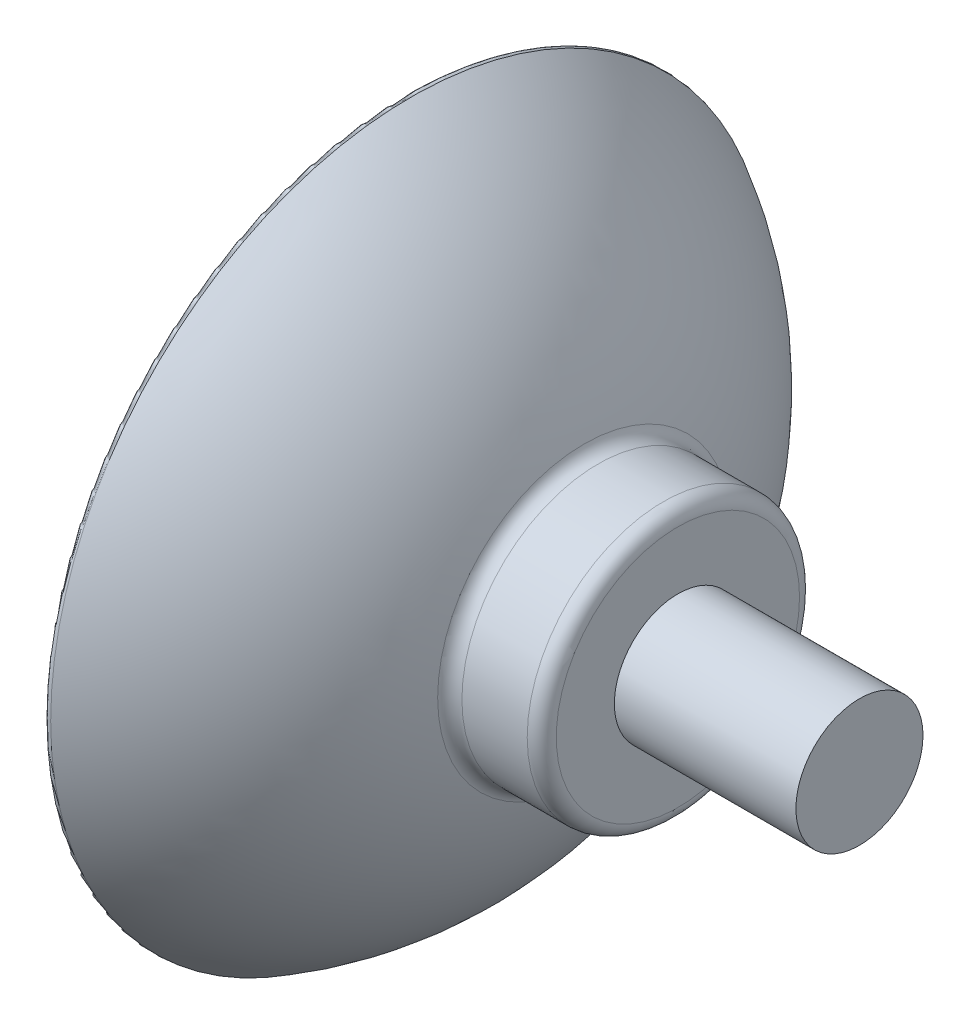
ISO-10303-21;
HEADER;
FILE_DESCRIPTION(('STEP AP214'),'2;1');
FILE_NAME('part.step','',(''),(''),'','','');
FILE_SCHEMA(('AUTOMOTIVE_DESIGN { 1 0 10303 214 1 1 1 1 }'));
ENDSEC;
DATA;
#1=APPLICATION_CONTEXT('core data for automotive mechanical design processes');
#2=APPLICATION_PROTOCOL_DEFINITION('international standard','automotive_design',2000,#1);
#3=PRODUCT_CONTEXT('',#1,'mechanical');
#4=PRODUCT('Part','Part','',(#3));
#5=PRODUCT_RELATED_PRODUCT_CATEGORY('part','',(#4));
#6=PRODUCT_DEFINITION_FORMATION('','',#4);
#7=PRODUCT_DEFINITION_CONTEXT('part definition',#1,'design');
#8=PRODUCT_DEFINITION('design','',#6,#7);
#9=PRODUCT_DEFINITION_SHAPE('','',#8);
#10=(LENGTH_UNIT() NAMED_UNIT(*) SI_UNIT(.MILLI.,.METRE.));
#11=(NAMED_UNIT(*) PLANE_ANGLE_UNIT() SI_UNIT($,.RADIAN.));
#12=(NAMED_UNIT(*) SI_UNIT($,.STERADIAN.) SOLID_ANGLE_UNIT());
#13=UNCERTAINTY_MEASURE_WITH_UNIT(LENGTH_MEASURE(1.E-05),#10,'distance_accuracy_value','');
#14=(GEOMETRIC_REPRESENTATION_CONTEXT(3) GLOBAL_UNCERTAINTY_ASSIGNED_CONTEXT((#13)) GLOBAL_UNIT_ASSIGNED_CONTEXT((#10,
#11,#12)) REPRESENTATION_CONTEXT('',''));
#15=CARTESIAN_POINT('',(0.,0.,0.));
#16=DIRECTION('',(0.,0.,1.));
#17=DIRECTION('',(1.,0.,0.));
#18=AXIS2_PLACEMENT_3D('',#15,#16,#17);
#19=CARTESIAN_POINT('',(-22.,0.,0.));
#20=DIRECTION('',(1.,0.,0.));
#21=DIRECTION('',(0.,0.,-1.));
#22=AXIS2_PLACEMENT_3D('',#19,#20,#21);
#23=DEGENERATE_TOROIDAL_SURFACE('',#22,1.06091108541422,22.,.T.);
#24=CARTESIAN_POINT('',(-9.90990990990991,0.,0.));
#25=DIRECTION('',(-1.,0.,0.));
#26=DIRECTION('',(0.,0.,1.));
#27=AXIS2_PLACEMENT_3D('',#24,#25,#26);
#28=CIRCLE('',#27,19.4410558512616);
#29=CARTESIAN_POINT('',(-9.90990990990991,0.,19.4410558512616));
#30=VERTEX_POINT('',#29);
#31=EDGE_CURVE('E41',#30,#30,#28,.T.);
#32=ORIENTED_EDGE('',*,*,#31,.T.);
#33=EDGE_LOOP('',(#32));
#34=FACE_BOUND('',#33,.T.);
#35=CARTESIAN_POINT('',(0.,0.,0.));
#36=DIRECTION('',(1.,0.,0.));
#37=DIRECTION('',(0.,0.,-1.));
#38=AXIS2_PLACEMENT_3D('',#35,#36,#37);
#39=CIRCLE('',#38,1.06091108541422);
#40=CARTESIAN_POINT('',(0.,0.,-1.06091108541422));
#41=VERTEX_POINT('',#40);
#42=EDGE_CURVE('E72',#41,#41,#39,.T.);
#43=ORIENTED_EDGE('',*,*,#42,.T.);
#44=EDGE_LOOP('',(#43));
#45=FACE_BOUND('',#44,.T.);
#46=ADVANCED_FACE('F33',(#34,#45),#23,.F.);
#47=CARTESIAN_POINT('',(0.,0.,0.));
#48=DIRECTION('',(1.,0.,0.));
#49=DIRECTION('',(0.,0.,-1.));
#50=AXIS2_PLACEMENT_3D('',#47,#48,#49);
#51=PLANE('',#50);
#52=ORIENTED_EDGE('',*,*,#42,.F.);
#53=EDGE_LOOP('',(#52));
#54=FACE_BOUND('',#53,.T.);
#55=ADVANCED_FACE('F103',(#54),#51,.F.);
#56=CARTESIAN_POINT('',(5.,0.,0.));
#57=DIRECTION('',(1.,0.,0.));
#58=DIRECTION('',(0.,0.,-1.));
#59=AXIS2_PLACEMENT_3D('',#56,#57,#58);
#60=PLANE('',#59);
#61=CARTESIAN_POINT('',(5.,0.,0.));
#62=DIRECTION('',(1.,0.,0.));
#63=DIRECTION('',(0.,0.,-1.));
#64=AXIS2_PLACEMENT_3D('',#61,#62,#63);
#65=CIRCLE('',#64,3.5);
#66=CARTESIAN_POINT('',(5.,0.,-3.5));
#67=VERTEX_POINT('',#66);
#68=EDGE_CURVE('E85',#67,#67,#65,.T.);
#69=ORIENTED_EDGE('',*,*,#68,.F.);
#70=EDGE_LOOP('',(#69));
#71=FACE_BOUND('',#70,.T.);
#72=CARTESIAN_POINT('',(5.,0.,0.));
#73=DIRECTION('',(1.,0.,0.));
#74=DIRECTION('',(0.,0.,-1.));
#75=AXIS2_PLACEMENT_3D('',#72,#73,#74);
#76=CIRCLE('',#75,6.7);
#77=CARTESIAN_POINT('',(5.,0.,-6.7));
#78=VERTEX_POINT('',#77);
#79=EDGE_CURVE('E66',#78,#78,#76,.T.);
#80=ORIENTED_EDGE('',*,*,#79,.T.);
#81=EDGE_LOOP('',(#80));
#82=FACE_BOUND('',#81,.T.);
#83=ADVANCED_FACE('F99',(#71,#82),#60,.T.);
#84=CARTESIAN_POINT('',(0.,0.,0.));
#85=DIRECTION('',(1.,0.,0.));
#86=DIRECTION('',(0.,0.,-1.));
#87=AXIS2_PLACEMENT_3D('',#84,#85,#86);
#88=CYLINDRICAL_SURFACE('',#87,7.5);
#89=CARTESIAN_POINT('',(4.2,0.,0.));
#90=DIRECTION('',(1.,0.,0.));
#91=DIRECTION('',(0.,0.,-1.));
#92=AXIS2_PLACEMENT_3D('',#89,#90,#91);
#93=CIRCLE('',#92,7.5);
#94=CARTESIAN_POINT('',(4.2,0.,-7.5));
#95=VERTEX_POINT('',#94);
#96=EDGE_CURVE('E57',#95,#95,#93,.F.);
#97=ORIENTED_EDGE('',*,*,#96,.T.);
#98=EDGE_LOOP('',(#97));
#99=FACE_BOUND('',#98,.T.);
#100=CARTESIAN_POINT('',(0.603657431340481,0.,0.));
#101=DIRECTION('',(1.,0.,0.));
#102=DIRECTION('',(0.,0.,-1.));
#103=AXIS2_PLACEMENT_3D('',#100,#101,#102);
#104=CIRCLE('',#103,7.5);
#105=CARTESIAN_POINT('',(0.603657431340481,0.,-7.5));
#106=VERTEX_POINT('',#105);
#107=EDGE_CURVE('E60',#106,#106,#104,.T.);
#108=ORIENTED_EDGE('',*,*,#107,.T.);
#109=EDGE_LOOP('',(#108));
#110=FACE_BOUND('',#109,.T.);
#111=ADVANCED_FACE('F102',(#99,#110),#88,.T.);
#112=CARTESIAN_POINT('',(-19.3122304000596,0.,0.));
#113=DIRECTION('',(1.,0.,0.));
#114=DIRECTION('',(0.,0.,-1.));
#115=AXIS2_PLACEMENT_3D('',#112,#113,#114);
#116=DEGENERATE_TOROIDAL_SURFACE('',#115,2.30021567995232,20.,.T.);
#117=CARTESIAN_POINT('',(-9.70391686464587,0.,0.));
#118=DIRECTION('',(-1.,0.,0.));
#119=DIRECTION('',(0.,0.,1.));
#120=AXIS2_PLACEMENT_3D('',#117,#118,#119);
#121=CIRCLE('',#120,19.8410341045637);
#122=CARTESIAN_POINT('',(-9.70391686464587,0.,19.8410341045637));
#123=VERTEX_POINT('',#122);
#124=EDGE_CURVE('E10',#123,#123,#121,.F.);
#125=ORIENTED_EDGE('',*,*,#124,.T.);
#126=EDGE_LOOP('',(#125));
#127=FACE_BOUND('',#126,.T.);
#128=CARTESIAN_POINT('',(-0.162338254482603,0.,0.));
#129=DIRECTION('',(-1.,0.,0.));
#130=DIRECTION('',(0.,0.,1.));
#131=AXIS2_PLACEMENT_3D('',#128,#129,#130);
#132=CIRCLE('',#131,8.06923906461355);
#133=CARTESIAN_POINT('',(-0.162338254482603,0.,8.06923906461355));
#134=VERTEX_POINT('',#133);
#135=EDGE_CURVE('E54',#134,#134,#132,.T.);
#136=ORIENTED_EDGE('',*,*,#135,.T.);
#137=EDGE_LOOP('',(#136));
#138=FACE_BOUND('',#137,.T.);
#139=ADVANCED_FACE('F120',(#127,#138),#116,.T.);
#140=CARTESIAN_POINT('',(-10.,0.,0.));
#141=DIRECTION('',(-1.,0.,0.));
#142=DIRECTION('',(0.,0.,1.));
#143=AXIS2_PLACEMENT_3D('',#140,#141,#142);
#144=PLANE('',#143);
#145=CARTESIAN_POINT('',(-10.,0.,0.));
#146=DIRECTION('',(-1.,0.,0.));
#147=DIRECTION('',(0.,0.,1.));
#148=AXIS2_PLACEMENT_3D('',#145,#146,#147);
#149=CIRCLE('',#148,19.6081480764056);
#150=CARTESIAN_POINT('',(-10.,0.,19.6081480764056));
#151=VERTEX_POINT('',#150);
#152=EDGE_CURVE('E45',#151,#151,#149,.F.);
#153=ORIENTED_EDGE('',*,*,#152,.T.);
#154=EDGE_LOOP('',(#153));
#155=FACE_BOUND('',#154,.T.);
#156=CARTESIAN_POINT('',(-10.,0.,0.));
#157=DIRECTION('',(-1.,0.,0.));
#158=DIRECTION('',(0.,0.,1.));
#159=AXIS2_PLACEMENT_3D('',#156,#157,#158);
#160=CIRCLE('',#159,19.6656259203176);
#161=CARTESIAN_POINT('',(-10.,0.,19.6656259203176));
#162=VERTEX_POINT('',#161);
#163=EDGE_CURVE('E49',#162,#162,#160,.T.);
#164=ORIENTED_EDGE('',*,*,#163,.T.);
#165=EDGE_LOOP('',(#164));
#166=FACE_BOUND('',#165,.T.);
#167=ADVANCED_FACE('F110',(#155,#166),#144,.T.);
#168=CARTESIAN_POINT('',(4.2,0.,0.));
#169=DIRECTION('',(1.,0.,0.));
#170=DIRECTION('',(0.,0.,-1.));
#171=AXIS2_PLACEMENT_3D('',#168,#169,#170);
#172=TOROIDAL_SURFACE('',#171,6.7,0.8);
#173=ORIENTED_EDGE('',*,*,#96,.F.);
#174=EDGE_LOOP('',(#173));
#175=FACE_BOUND('',#174,.T.);
#176=ORIENTED_EDGE('',*,*,#79,.F.);
#177=EDGE_LOOP('',(#176));
#178=FACE_BOUND('',#177,.T.);
#179=ADVANCED_FACE('F107',(#175,#178),#172,.T.);
#180=CARTESIAN_POINT('',(0.603657431340481,0.,0.));
#181=DIRECTION('',(1.,0.,0.));
#182=DIRECTION('',(0.,0.,-1.));
#183=AXIS2_PLACEMENT_3D('',#180,#181,#182);
#184=TOROIDAL_SURFACE('',#183,8.3,0.8);
#185=ORIENTED_EDGE('',*,*,#135,.F.);
#186=EDGE_LOOP('',(#185));
#187=FACE_BOUND('',#186,.T.);
#188=ORIENTED_EDGE('',*,*,#107,.F.);
#189=EDGE_LOOP('',(#188));
#190=FACE_BOUND('',#189,.T.);
#191=ADVANCED_FACE('F109',(#187,#190),#184,.F.);
#192=CARTESIAN_POINT('',(-9.8,0.,0.));
#193=DIRECTION('',(-1.,0.,0.));
#194=DIRECTION('',(0.,0.,1.));
#195=AXIS2_PLACEMENT_3D('',#192,#193,#194);
#196=TOROIDAL_SURFACE('',#195,19.6081480764056,0.2);
#197=ORIENTED_EDGE('',*,*,#31,.F.);
#198=EDGE_LOOP('',(#197));
#199=FACE_BOUND('',#198,.T.);
#200=ORIENTED_EDGE('',*,*,#152,.F.);
#201=EDGE_LOOP('',(#200));
#202=FACE_BOUND('',#201,.T.);
#203=ADVANCED_FACE('F117',(#199,#202),#196,.T.);
#204=CARTESIAN_POINT('',(-9.8,0.,0.));
#205=DIRECTION('',(-1.,0.,0.));
#206=DIRECTION('',(0.,0.,1.));
#207=AXIS2_PLACEMENT_3D('',#204,#205,#206);
#208=TOROIDAL_SURFACE('',#207,19.6656259203176,0.2);
#209=ORIENTED_EDGE('',*,*,#163,.F.);
#210=EDGE_LOOP('',(#209));
#211=FACE_BOUND('',#210,.T.);
#212=ORIENTED_EDGE('',*,*,#124,.F.);
#213=EDGE_LOOP('',(#212));
#214=FACE_BOUND('',#213,.T.);
#215=ADVANCED_FACE('F35',(#211,#214),#208,.T.);
#216=CARTESIAN_POINT('',(15.,0.,0.));
#217=DIRECTION('',(-1.,0.,0.));
#218=DIRECTION('',(0.,0.,1.));
#219=AXIS2_PLACEMENT_3D('',#216,#217,#218);
#220=CYLINDRICAL_SURFACE('',#219,3.5);
#221=CARTESIAN_POINT('',(15.,0.,0.));
#222=DIRECTION('',(1.,0.,0.));
#223=DIRECTION('',(0.,0.,-1.));
#224=AXIS2_PLACEMENT_3D('',#221,#222,#223);
#225=CIRCLE('',#224,3.5);
#226=CARTESIAN_POINT('',(15.,0.,-3.5));
#227=VERTEX_POINT('',#226);
#228=EDGE_CURVE('E84',#227,#227,#225,.T.);
#229=ORIENTED_EDGE('',*,*,#228,.F.);
#230=EDGE_LOOP('',(#229));
#231=FACE_BOUND('',#230,.T.);
#232=ORIENTED_EDGE('',*,*,#68,.T.);
#233=EDGE_LOOP('',(#232));
#234=FACE_BOUND('',#233,.T.);
#235=ADVANCED_FACE('F93',(#231,#234),#220,.T.);
#236=CARTESIAN_POINT('',(15.,0.,0.));
#237=DIRECTION('',(1.,0.,0.));
#238=DIRECTION('',(0.,0.,-1.));
#239=AXIS2_PLACEMENT_3D('',#236,#237,#238);
#240=PLANE('',#239);
#241=ORIENTED_EDGE('',*,*,#228,.T.);
#242=EDGE_LOOP('',(#241));
#243=FACE_BOUND('',#242,.T.);
#244=ADVANCED_FACE('F91',(#243),#240,.T.);
#245=CLOSED_SHELL('',(#46,#55,#83,#111,#139,#167,#179,#191,#203,#215,#235,#244));
#246=CARTESIAN_POINT('',(5.,0.,0.));
#247=DIRECTION('',(1.,0.,0.));
#248=DIRECTION('',(0.,0.,-1.));
#249=AXIS2_PLACEMENT_3D('',#246,#247,#248);
#250=PLANE('',#249);
#251=CARTESIAN_POINT('',(5.,0.,0.));
#252=DIRECTION('',(1.,0.,0.));
#253=DIRECTION('',(0.,0.,-1.));
#254=AXIS2_PLACEMENT_3D('',#251,#252,#253);
#255=CIRCLE('',#254,3.2);
#256=CARTESIAN_POINT('',(5.,0.,-3.2));
#257=VERTEX_POINT('',#256);
#258=EDGE_CURVE('E63',#257,#257,#255,.F.);
#259=ORIENTED_EDGE('',*,*,#258,.T.);
#260=EDGE_LOOP('',(#259));
#261=FACE_BOUND('',#260,.T.);
#262=ADVANCED_FACE('F147',(#261),#250,.F.);
#263=CARTESIAN_POINT('',(2.,0.,0.));
#264=DIRECTION('',(1.,0.,0.));
#265=DIRECTION('',(0.,0.,-1.));
#266=AXIS2_PLACEMENT_3D('',#263,#264,#265);
#267=PLANE('',#266);
#268=CARTESIAN_POINT('',(2.,0.,0.));
#269=DIRECTION('',(1.,0.,0.));
#270=DIRECTION('',(0.,0.,-1.));
#271=AXIS2_PLACEMENT_3D('',#268,#269,#270);
#272=CIRCLE('',#271,4.75);
#273=CARTESIAN_POINT('',(2.,0.,-4.75));
#274=VERTEX_POINT('',#273);
#275=EDGE_CURVE('E75',#274,#274,#272,.T.);
#276=ORIENTED_EDGE('',*,*,#275,.T.);
#277=EDGE_LOOP('',(#276));
#278=FACE_BOUND('',#277,.T.);
#279=ADVANCED_FACE('F149',(#278),#267,.T.);
#280=CARTESIAN_POINT('',(0.,0.,0.));
#281=DIRECTION('',(1.,0.,0.));
#282=DIRECTION('',(0.,0.,-1.));
#283=AXIS2_PLACEMENT_3D('',#280,#281,#282);
#284=CYLINDRICAL_SURFACE('',#283,4.75);
#285=CARTESIAN_POINT('',(4.,0.,0.));
#286=DIRECTION('',(1.,0.,0.));
#287=DIRECTION('',(0.,0.,-1.));
#288=AXIS2_PLACEMENT_3D('',#285,#286,#287);
#289=CIRCLE('',#288,4.75);
#290=CARTESIAN_POINT('',(4.,0.,-4.75));
#291=VERTEX_POINT('',#290);
#292=EDGE_CURVE('E78',#291,#291,#289,.T.);
#293=ORIENTED_EDGE('',*,*,#292,.T.);
#294=EDGE_LOOP('',(#293));
#295=FACE_BOUND('',#294,.T.);
#296=ORIENTED_EDGE('',*,*,#275,.F.);
#297=EDGE_LOOP('',(#296));
#298=FACE_BOUND('',#297,.T.);
#299=ADVANCED_FACE('F156',(#295,#298),#284,.F.);
#300=CARTESIAN_POINT('',(4.,0.,0.));
#301=DIRECTION('',(1.,0.,0.));
#302=DIRECTION('',(0.,0.,-1.));
#303=AXIS2_PLACEMENT_3D('',#300,#301,#302);
#304=PLANE('',#303);
#305=CARTESIAN_POINT('',(4.,0.,0.));
#306=DIRECTION('',(1.,0.,0.));
#307=DIRECTION('',(0.,0.,-1.));
#308=AXIS2_PLACEMENT_3D('',#305,#306,#307);
#309=CIRCLE('',#308,2.4);
#310=CARTESIAN_POINT('',(4.,0.,-2.4));
#311=VERTEX_POINT('',#310);
#312=EDGE_CURVE('E81',#311,#311,#309,.T.);
#313=ORIENTED_EDGE('',*,*,#312,.T.);
#314=EDGE_LOOP('',(#313));
#315=FACE_BOUND('',#314,.T.);
#316=ORIENTED_EDGE('',*,*,#292,.F.);
#317=EDGE_LOOP('',(#316));
#318=FACE_BOUND('',#317,.T.);
#319=ADVANCED_FACE('F142',(#315,#318),#304,.F.);
#320=CARTESIAN_POINT('',(4.,0.,0.));
#321=DIRECTION('',(1.,0.,0.));
#322=DIRECTION('',(0.,0.,-1.));
#323=AXIS2_PLACEMENT_3D('',#320,#321,#322);
#324=CYLINDRICAL_SURFACE('',#323,2.4);
#325=CARTESIAN_POINT('',(4.2,0.,0.));
#326=DIRECTION('',(1.,0.,0.));
#327=DIRECTION('',(0.,0.,-1.));
#328=AXIS2_PLACEMENT_3D('',#325,#326,#327);
#329=CIRCLE('',#328,2.4);
#330=CARTESIAN_POINT('',(4.2,0.,-2.4));
#331=VERTEX_POINT('',#330);
#332=EDGE_CURVE('E69',#331,#331,#329,.T.);
#333=ORIENTED_EDGE('',*,*,#332,.T.);
#334=EDGE_LOOP('',(#333));
#335=FACE_BOUND('',#334,.T.);
#336=ORIENTED_EDGE('',*,*,#312,.F.);
#337=EDGE_LOOP('',(#336));
#338=FACE_BOUND('',#337,.T.);
#339=ADVANCED_FACE('F136',(#335,#338),#324,.F.);
#340=CARTESIAN_POINT('',(4.2,0.,0.));
#341=DIRECTION('',(1.,0.,0.));
#342=DIRECTION('',(0.,0.,-1.));
#343=AXIS2_PLACEMENT_3D('',#340,#341,#342);
#344=TOROIDAL_SURFACE('',#343,3.2,0.8);
#345=ORIENTED_EDGE('',*,*,#258,.F.);
#346=EDGE_LOOP('',(#345));
#347=FACE_BOUND('',#346,.T.);
#348=ORIENTED_EDGE('',*,*,#332,.F.);
#349=EDGE_LOOP('',(#348));
#350=FACE_BOUND('',#349,.T.);
#351=ADVANCED_FACE('F134',(#347,#350),#344,.T.);
#352=CLOSED_SHELL('',(#262,#279,#299,#319,#339,#351));
#353=ORIENTED_CLOSED_SHELL('',*,#352,.T.);
#354=BREP_WITH_VOIDS('B2',#245,(#353));
#355=ADVANCED_BREP_SHAPE_REPRESENTATION('',(#18,#354),#14);
#356=SHAPE_DEFINITION_REPRESENTATION(#9,#355);
ENDSEC;
END-ISO-10303-21;
